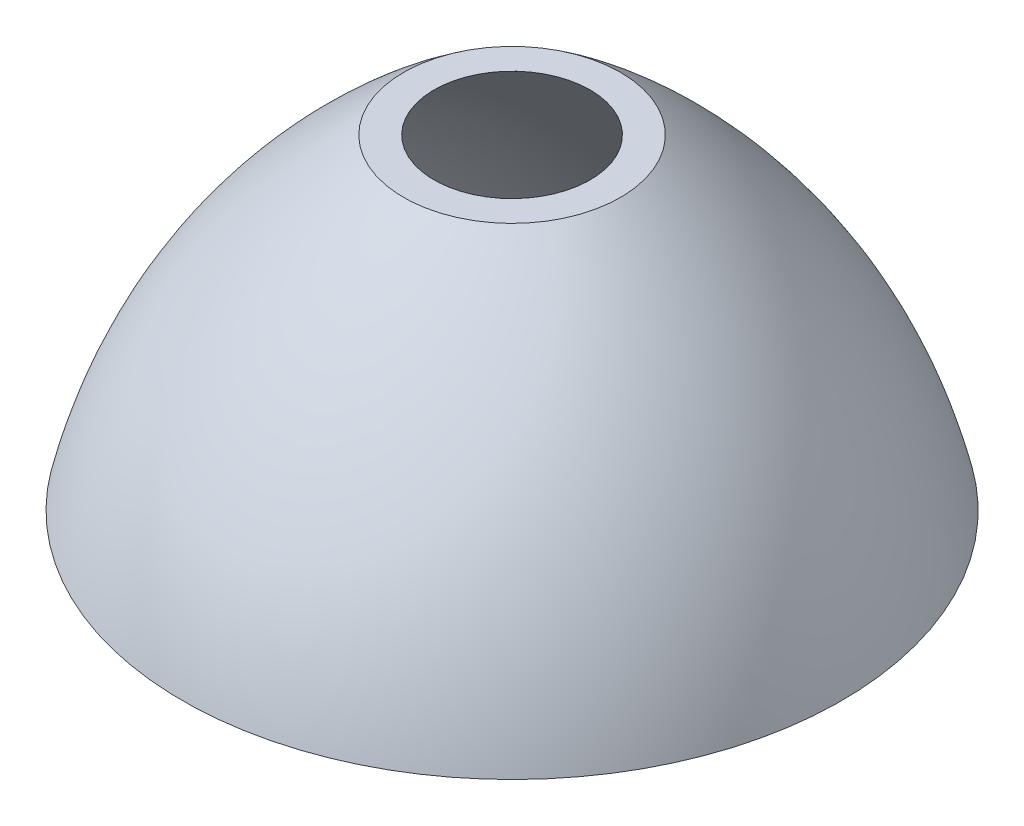
ISO-10303-21;
HEADER;
FILE_DESCRIPTION(('STEP AP214'),'2;1');
FILE_NAME('part.step','',(''),(''),'','','');
FILE_SCHEMA(('AUTOMOTIVE_DESIGN { 1 0 10303 214 1 1 1 1 }'));
ENDSEC;
DATA;
#1=APPLICATION_CONTEXT('core data for automotive mechanical design processes');
#2=APPLICATION_PROTOCOL_DEFINITION('international standard','automotive_design',2000,#1);
#3=PRODUCT_CONTEXT('',#1,'mechanical');
#4=PRODUCT('Part','Part','',(#3));
#5=PRODUCT_RELATED_PRODUCT_CATEGORY('part','',(#4));
#6=PRODUCT_DEFINITION_FORMATION('','',#4);
#7=PRODUCT_DEFINITION_CONTEXT('part definition',#1,'design');
#8=PRODUCT_DEFINITION('design','',#6,#7);
#9=PRODUCT_DEFINITION_SHAPE('','',#8);
#10=(LENGTH_UNIT() NAMED_UNIT(*) SI_UNIT(.MILLI.,.METRE.));
#11=(NAMED_UNIT(*) PLANE_ANGLE_UNIT() SI_UNIT($,.RADIAN.));
#12=(NAMED_UNIT(*) SI_UNIT($,.STERADIAN.) SOLID_ANGLE_UNIT());
#13=UNCERTAINTY_MEASURE_WITH_UNIT(LENGTH_MEASURE(1.E-05),#10,'distance_accuracy_value','');
#14=(GEOMETRIC_REPRESENTATION_CONTEXT(3) GLOBAL_UNCERTAINTY_ASSIGNED_CONTEXT((#13)) GLOBAL_UNIT_ASSIGNED_CONTEXT((#10,
#11,#12)) REPRESENTATION_CONTEXT('',''));
#15=CARTESIAN_POINT('',(0.,0.,0.));
#16=DIRECTION('',(0.,0.,1.));
#17=DIRECTION('',(1.,0.,0.));
#18=AXIS2_PLACEMENT_3D('',#15,#16,#17);
#19=CARTESIAN_POINT('',(-76.,-1.11022302462516E-13,0.));
#20=CARTESIAN_POINT('',(-65.3679843261224,45.3534402890529,0.));
#21=CARTESIAN_POINT('',(-25.,75.,0.));
#22=B_SPLINE_CURVE_WITH_KNOTS('',2,(#19,#20,#21),.UNSPECIFIED.,.F.,.F.,(3,3),(0.,1.),.UNSPECIFIED.);
#23=CARTESIAN_POINT('',(0.,0.,0.));
#24=DIRECTION('',(0.,-1.,0.));
#25=AXIS1_PLACEMENT('',#23,#24);
#26=SURFACE_OF_REVOLUTION('',#22,#25);
#27=CARTESIAN_POINT('',(0.,75.0000000000001,0.));
#28=DIRECTION('',(0.,-1.,0.));
#29=DIRECTION('',(0.,0.,-1.));
#30=AXIS2_PLACEMENT_3D('',#27,#28,#29);
#31=CIRCLE('',#30,25.);
#32=CARTESIAN_POINT('',(0.,75.0000000000001,-25.0000000000001));
#33=VERTEX_POINT('',#32);
#34=EDGE_CURVE('E61',#33,#33,#31,.T.);
#35=ORIENTED_EDGE('',*,*,#34,.T.);
#36=EDGE_LOOP('',(#35));
#37=FACE_BOUND('',#36,.T.);
#38=CARTESIAN_POINT('',(0.,0.,0.));
#39=DIRECTION('',(0.,-1.,0.));
#40=DIRECTION('',(0.,0.,-1.));
#41=AXIS2_PLACEMENT_3D('',#38,#39,#40);
#42=CIRCLE('',#41,76.);
#43=CARTESIAN_POINT('',(0.,0.,-76.));
#44=VERTEX_POINT('',#43);
#45=EDGE_CURVE('E12',#44,#44,#42,.T.);
#46=ORIENTED_EDGE('',*,*,#45,.F.);
#47=EDGE_LOOP('',(#46));
#48=FACE_BOUND('',#47,.T.);
#49=ADVANCED_FACE('F46',(#37,#48),#26,.F.);
#50=CARTESIAN_POINT('',(0.,0.,0.));
#51=DIRECTION('',(0.,-1.,0.));
#52=DIRECTION('',(0.,0.,-1.));
#53=AXIS2_PLACEMENT_3D('',#50,#51,#52);
#54=PLANE('',#53);
#55=ORIENTED_EDGE('',*,*,#45,.T.);
#56=EDGE_LOOP('',(#55));
#57=FACE_BOUND('',#56,.T.);
#58=CARTESIAN_POINT('',(0.,0.,0.));
#59=DIRECTION('',(0.,-1.,0.));
#60=DIRECTION('',(0.,0.,-1.));
#61=AXIS2_PLACEMENT_3D('',#58,#59,#60);
#62=CIRCLE('',#61,75.);
#63=CARTESIAN_POINT('',(0.,0.,-75.));
#64=VERTEX_POINT('',#63);
#65=EDGE_CURVE('E53',#64,#64,#62,.T.);
#66=ORIENTED_EDGE('',*,*,#65,.F.);
#67=EDGE_LOOP('',(#66));
#68=FACE_BOUND('',#67,.T.);
#69=ADVANCED_FACE('F80',(#57,#68),#54,.T.);
#70=CARTESIAN_POINT('',(-75.,0.,-1.11022302462516E-13));
#71=CARTESIAN_POINT('',(-58.4062741132546,46.5970360454982,0.));
#72=CARTESIAN_POINT('',(-18.,75.,0.));
#73=B_SPLINE_CURVE_WITH_KNOTS('',2,(#70,#71,#72),.UNSPECIFIED.,.F.,.F.,(3,3),(0.,1.),.UNSPECIFIED.);
#74=CARTESIAN_POINT('',(0.,0.,0.));
#75=DIRECTION('',(0.,-1.,0.));
#76=AXIS1_PLACEMENT('',#74,#75);
#77=SURFACE_OF_REVOLUTION('',#73,#76);
#78=CARTESIAN_POINT('',(0.,75.0000000000001,0.));
#79=DIRECTION('',(0.,-1.,0.));
#80=DIRECTION('',(0.,0.,-1.));
#81=AXIS2_PLACEMENT_3D('',#78,#79,#80);
#82=CIRCLE('',#81,18.);
#83=CARTESIAN_POINT('',(0.,75.0000000000001,-18.0000000000001));
#84=VERTEX_POINT('',#83);
#85=EDGE_CURVE('E57',#84,#84,#82,.T.);
#86=ORIENTED_EDGE('',*,*,#85,.F.);
#87=EDGE_LOOP('',(#86));
#88=FACE_BOUND('',#87,.T.);
#89=ORIENTED_EDGE('',*,*,#65,.T.);
#90=EDGE_LOOP('',(#89));
#91=FACE_BOUND('',#90,.T.);
#92=ADVANCED_FACE('F76',(#88,#91),#77,.T.);
#93=CARTESIAN_POINT('',(0.,75.0000000000001,0.));
#94=DIRECTION('',(0.,-1.,0.));
#95=DIRECTION('',(0.,0.,-1.));
#96=AXIS2_PLACEMENT_3D('',#93,#94,#95);
#97=PLANE('',#96);
#98=ORIENTED_EDGE('',*,*,#34,.F.);
#99=EDGE_LOOP('',(#98));
#100=FACE_BOUND('',#99,.T.);
#101=ORIENTED_EDGE('',*,*,#85,.T.);
#102=EDGE_LOOP('',(#101));
#103=FACE_BOUND('',#102,.T.);
#104=ADVANCED_FACE('F79',(#100,#103),#97,.F.);
#105=CLOSED_SHELL('',(#49,#69,#92,#104));
#106=MANIFOLD_SOLID_BREP('B2',#105);
#107=ADVANCED_BREP_SHAPE_REPRESENTATION('',(#18,#106),#14);
#108=SHAPE_DEFINITION_REPRESENTATION(#9,#107);
ENDSEC;
END-ISO-10303-21;
